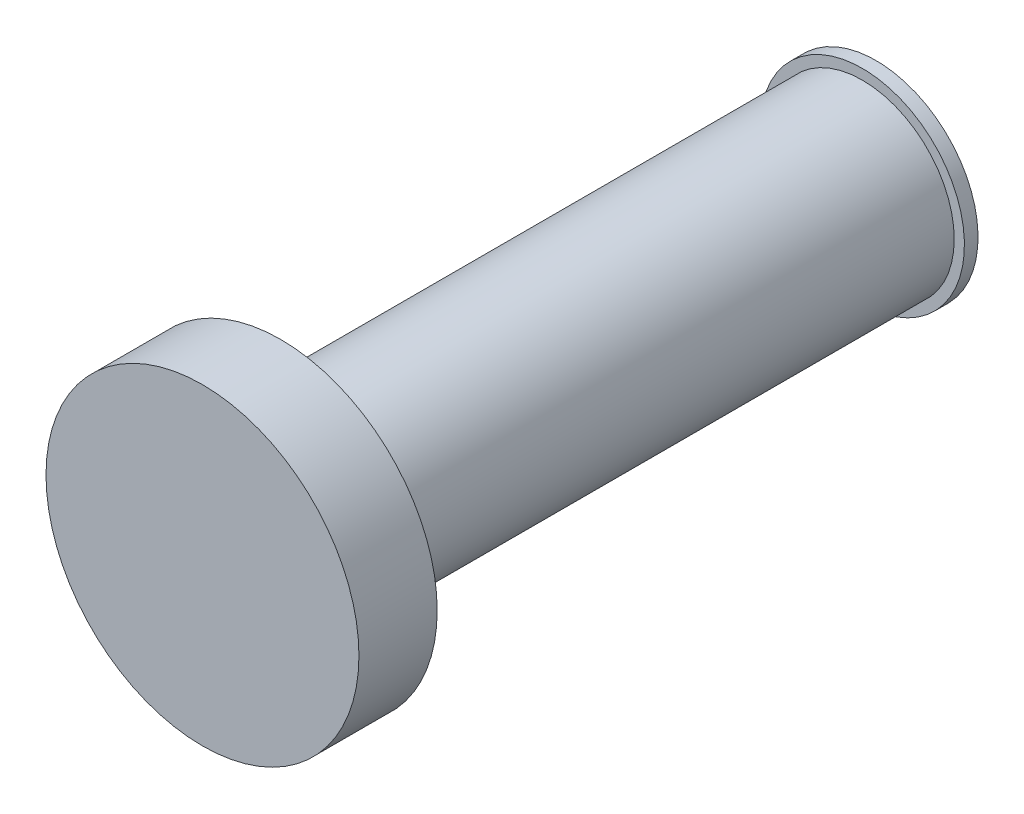
ISO-10303-21;
HEADER;
FILE_DESCRIPTION(('STEP AP214'),'2;1');
FILE_NAME('part.step','',(''),(''),'','','');
FILE_SCHEMA(('AUTOMOTIVE_DESIGN { 1 0 10303 214 1 1 1 1 }'));
ENDSEC;
DATA;
#1=APPLICATION_CONTEXT('core data for automotive mechanical design processes');
#2=APPLICATION_PROTOCOL_DEFINITION('international standard','automotive_design',2000,#1);
#3=PRODUCT_CONTEXT('',#1,'mechanical');
#4=PRODUCT('Part','Part','',(#3));
#5=PRODUCT_RELATED_PRODUCT_CATEGORY('part','',(#4));
#6=PRODUCT_DEFINITION_FORMATION('','',#4);
#7=PRODUCT_DEFINITION_CONTEXT('part definition',#1,'design');
#8=PRODUCT_DEFINITION('design','',#6,#7);
#9=PRODUCT_DEFINITION_SHAPE('','',#8);
#10=(LENGTH_UNIT() NAMED_UNIT(*) SI_UNIT(.MILLI.,.METRE.));
#11=(NAMED_UNIT(*) PLANE_ANGLE_UNIT() SI_UNIT($,.RADIAN.));
#12=(NAMED_UNIT(*) SI_UNIT($,.STERADIAN.) SOLID_ANGLE_UNIT());
#13=UNCERTAINTY_MEASURE_WITH_UNIT(LENGTH_MEASURE(1.E-05),#10,'distance_accuracy_value','');
#14=(GEOMETRIC_REPRESENTATION_CONTEXT(3) GLOBAL_UNCERTAINTY_ASSIGNED_CONTEXT((#13)) GLOBAL_UNIT_ASSIGNED_CONTEXT((#10,
#11,#12)) REPRESENTATION_CONTEXT('',''));
#15=CARTESIAN_POINT('',(0.,0.,0.));
#16=DIRECTION('',(0.,0.,1.));
#17=DIRECTION('',(1.,0.,0.));
#18=AXIS2_PLACEMENT_3D('',#15,#16,#17);
#19=CARTESIAN_POINT('',(0.,0.,-5.425));
#20=DIRECTION('',(0.,0.,1.));
#21=DIRECTION('',(1.,0.,0.));
#22=AXIS2_PLACEMENT_3D('',#19,#20,#21);
#23=CYLINDRICAL_SURFACE('',#22,1.5);
#24=CARTESIAN_POINT('',(0.,0.,-4.275));
#25=DIRECTION('',(0.,0.,-1.));
#26=DIRECTION('',(-1.,0.,0.));
#27=AXIS2_PLACEMENT_3D('',#24,#25,#26);
#28=CIRCLE('',#27,1.5);
#29=CARTESIAN_POINT('',(-1.5,0.,-4.275));
#30=VERTEX_POINT('',#29);
#31=EDGE_CURVE('E56',#30,#30,#28,.T.);
#32=ORIENTED_EDGE('',*,*,#31,.T.);
#33=EDGE_LOOP('',(#32));
#34=FACE_BOUND('',#33,.T.);
#35=CARTESIAN_POINT('',(0.,0.,-4.475));
#36=DIRECTION('',(0.,0.,1.));
#37=DIRECTION('',(0.,-1.,0.));
#38=AXIS2_PLACEMENT_3D('',#35,#36,#37);
#39=CIRCLE('',#38,1.5);
#40=CARTESIAN_POINT('',(0.,-1.5,-4.475));
#41=VERTEX_POINT('',#40);
#42=EDGE_CURVE('E59',#41,#41,#39,.T.);
#43=ORIENTED_EDGE('',*,*,#42,.T.);
#44=EDGE_LOOP('',(#43));
#45=FACE_BOUND('',#44,.T.);
#46=ADVANCED_FACE('F39',(#34,#45),#23,.T.);
#47=CARTESIAN_POINT('',(0.,0.,4.275));
#48=DIRECTION('',(0.,0.,-1.));
#49=DIRECTION('',(-1.,0.,0.));
#50=AXIS2_PLACEMENT_3D('',#47,#48,#49);
#51=CYLINDRICAL_SURFACE('',#50,1.35);
#52=CARTESIAN_POINT('',(0.,0.,4.275));
#53=DIRECTION('',(0.,0.,1.));
#54=DIRECTION('',(1.,0.,0.));
#55=AXIS2_PLACEMENT_3D('',#52,#53,#54);
#56=CIRCLE('',#55,1.35);
#57=CARTESIAN_POINT('',(1.35,0.,4.275));
#58=VERTEX_POINT('',#57);
#59=EDGE_CURVE('E10',#58,#58,#56,.T.);
#60=ORIENTED_EDGE('',*,*,#59,.F.);
#61=EDGE_LOOP('',(#60));
#62=FACE_BOUND('',#61,.T.);
#63=CARTESIAN_POINT('',(0.,0.,-4.275));
#64=DIRECTION('',(0.,0.,1.));
#65=DIRECTION('',(1.,0.,0.));
#66=AXIS2_PLACEMENT_3D('',#63,#64,#65);
#67=CIRCLE('',#66,1.35);
#68=CARTESIAN_POINT('',(1.35,0.,-4.275));
#69=VERTEX_POINT('',#68);
#70=EDGE_CURVE('E43',#69,#69,#67,.T.);
#71=ORIENTED_EDGE('',*,*,#70,.T.);
#72=EDGE_LOOP('',(#71));
#73=FACE_BOUND('',#72,.T.);
#74=ADVANCED_FACE('F41',(#62,#73),#51,.T.);
#75=CARTESIAN_POINT('',(0.,0.0240444249375334,5.425));
#76=DIRECTION('',(0.,0.,-1.));
#77=DIRECTION('',(-1.,0.,0.));
#78=AXIS2_PLACEMENT_3D('',#75,#76,#77);
#79=CYLINDRICAL_SURFACE('',#78,2.3);
#80=CARTESIAN_POINT('',(0.,0.0240444249375334,5.425));
#81=DIRECTION('',(0.,0.,1.));
#82=DIRECTION('',(1.,0.,0.));
#83=AXIS2_PLACEMENT_3D('',#80,#81,#82);
#84=CIRCLE('',#83,2.3);
#85=CARTESIAN_POINT('',(2.3,0.0240444249375334,5.425));
#86=VERTEX_POINT('',#85);
#87=EDGE_CURVE('E47',#86,#86,#84,.T.);
#88=ORIENTED_EDGE('',*,*,#87,.F.);
#89=EDGE_LOOP('',(#88));
#90=FACE_BOUND('',#89,.T.);
#91=CARTESIAN_POINT('',(0.,0.0240444249375334,4.275));
#92=DIRECTION('',(0.,0.,1.));
#93=DIRECTION('',(1.,0.,0.));
#94=AXIS2_PLACEMENT_3D('',#91,#92,#93);
#95=CIRCLE('',#94,2.3);
#96=CARTESIAN_POINT('',(2.3,0.0240444249375334,4.275));
#97=VERTEX_POINT('',#96);
#98=EDGE_CURVE('E51',#97,#97,#95,.T.);
#99=ORIENTED_EDGE('',*,*,#98,.T.);
#100=EDGE_LOOP('',(#99));
#101=FACE_BOUND('',#100,.T.);
#102=ADVANCED_FACE('F87',(#90,#101),#79,.T.);
#103=CARTESIAN_POINT('',(0.,0.0240444249375334,5.425));
#104=DIRECTION('',(0.,0.,1.));
#105=DIRECTION('',(1.,0.,0.));
#106=AXIS2_PLACEMENT_3D('',#103,#104,#105);
#107=PLANE('',#106);
#108=ORIENTED_EDGE('',*,*,#87,.T.);
#109=EDGE_LOOP('',(#108));
#110=FACE_BOUND('',#109,.T.);
#111=ADVANCED_FACE('F91',(#110),#107,.T.);
#112=CARTESIAN_POINT('',(0.,0.0240444249375334,4.275));
#113=DIRECTION('',(0.,0.,1.));
#114=DIRECTION('',(1.,0.,0.));
#115=AXIS2_PLACEMENT_3D('',#112,#113,#114);
#116=PLANE('',#115);
#117=ORIENTED_EDGE('',*,*,#59,.T.);
#118=EDGE_LOOP('',(#117));
#119=FACE_BOUND('',#118,.T.);
#120=ORIENTED_EDGE('',*,*,#98,.F.);
#121=EDGE_LOOP('',(#120));
#122=FACE_BOUND('',#121,.T.);
#123=ADVANCED_FACE('F79',(#119,#122),#116,.F.);
#124=CARTESIAN_POINT('',(0.,0.,-4.275));
#125=DIRECTION('',(0.,0.,-1.));
#126=DIRECTION('',(-1.,0.,0.));
#127=AXIS2_PLACEMENT_3D('',#124,#125,#126);
#128=PLANE('',#127);
#129=ORIENTED_EDGE('',*,*,#70,.F.);
#130=EDGE_LOOP('',(#129));
#131=FACE_BOUND('',#130,.T.);
#132=ORIENTED_EDGE('',*,*,#31,.F.);
#133=EDGE_LOOP('',(#132));
#134=FACE_BOUND('',#133,.T.);
#135=ADVANCED_FACE('F71',(#131,#134),#128,.F.);
#136=CARTESIAN_POINT('',(0.,0.,-5.225));
#137=DIRECTION('',(0.,0.,1.));
#138=DIRECTION('',(0.,-1.,0.));
#139=AXIS2_PLACEMENT_3D('',#136,#137,#138);
#140=PLANE('',#139);
#141=CARTESIAN_POINT('',(0.,0.,-5.225));
#142=DIRECTION('',(0.,0.,1.));
#143=DIRECTION('',(0.,-1.,0.));
#144=AXIS2_PLACEMENT_3D('',#141,#142,#143);
#145=CIRCLE('',#144,0.2);
#146=CARTESIAN_POINT('',(0.,-0.200000000000001,-5.225));
#147=VERTEX_POINT('',#146);
#148=EDGE_CURVE('E62',#147,#147,#145,.T.);
#149=ORIENTED_EDGE('',*,*,#148,.F.);
#150=EDGE_LOOP('',(#149));
#151=FACE_BOUND('',#150,.T.);
#152=ADVANCED_FACE('F69',(#151),#140,.F.);
#153=CARTESIAN_POINT('',(0.,0.,-4.475));
#154=DIRECTION('',(0.,0.,1.));
#155=DIRECTION('',(0.,-1.,0.));
#156=AXIS2_PLACEMENT_3D('',#153,#154,#155);
#157=CONICAL_SURFACE('',#156,1.5,1.04751800466292);
#158=CARTESIAN_POINT('',(0.,-0.200000000000001,-5.225));
#159=CARTESIAN_POINT('',(0.,-0.213541666666667,-5.2171875));
#160=CARTESIAN_POINT('',(0.,-0.227083333333334,-5.209375));
#161=CARTESIAN_POINT('',(0.,-0.254166666666668,-5.19375));
#162=CARTESIAN_POINT('',(0.,-0.267708333333335,-5.1859375));
#163=CARTESIAN_POINT('',(0.,-0.294791666666668,-5.1703125));
#164=CARTESIAN_POINT('',(0.,-0.308333333333335,-5.1625));
#165=CARTESIAN_POINT('',(0.,-0.335416666666668,-5.146875));
#166=CARTESIAN_POINT('',(0.,-0.348958333333334,-5.1390625));
#167=CARTESIAN_POINT('',(0.,-0.376041666666668,-5.1234375));
#168=CARTESIAN_POINT('',(0.,-0.389583333333334,-5.115625));
#169=CARTESIAN_POINT('',(0.,-0.416666666666668,-5.1));
#170=CARTESIAN_POINT('',(0.,-0.430208333333334,-5.0921875));
#171=CARTESIAN_POINT('',(0.,-0.457291666666668,-5.0765625));
#172=CARTESIAN_POINT('',(0.,-0.470833333333334,-5.06875));
#173=CARTESIAN_POINT('',(0.,-0.497916666666668,-5.053125));
#174=CARTESIAN_POINT('',(0.,-0.511458333333334,-5.0453125));
#175=CARTESIAN_POINT('',(0.,-0.538541666666668,-5.0296875));
#176=CARTESIAN_POINT('',(0.,-0.552083333333334,-5.021875));
#177=CARTESIAN_POINT('',(0.,-0.579166666666668,-5.00625));
#178=CARTESIAN_POINT('',(0.,-0.592708333333334,-4.9984375));
#179=CARTESIAN_POINT('',(0.,-0.619791666666668,-4.9828125));
#180=CARTESIAN_POINT('',(0.,-0.633333333333334,-4.975));
#181=CARTESIAN_POINT('',(0.,-0.660416666666668,-4.959375));
#182=CARTESIAN_POINT('',(0.,-0.673958333333334,-4.9515625));
#183=CARTESIAN_POINT('',(0.,-0.701041666666668,-4.9359375));
#184=CARTESIAN_POINT('',(0.,-0.714583333333334,-4.928125));
#185=CARTESIAN_POINT('',(0.,-0.741666666666667,-4.9125));
#186=CARTESIAN_POINT('',(0.,-0.755208333333334,-4.9046875));
#187=CARTESIAN_POINT('',(0.,-0.782291666666668,-4.8890625));
#188=CARTESIAN_POINT('',(0.,-0.795833333333334,-4.88125));
#189=CARTESIAN_POINT('',(0.,-0.822916666666668,-4.865625));
#190=CARTESIAN_POINT('',(0.,-0.836458333333334,-4.8578125));
#191=CARTESIAN_POINT('',(0.,-0.863541666666667,-4.8421875));
#192=CARTESIAN_POINT('',(0.,-0.877083333333334,-4.834375));
#193=CARTESIAN_POINT('',(0.,-0.904166666666667,-4.81875));
#194=CARTESIAN_POINT('',(0.,-0.917708333333334,-4.8109375));
#195=CARTESIAN_POINT('',(0.,-0.944791666666667,-4.7953125));
#196=CARTESIAN_POINT('',(0.,-0.958333333333334,-4.7875));
#197=CARTESIAN_POINT('',(0.,-0.985416666666667,-4.771875));
#198=CARTESIAN_POINT('',(0.,-0.998958333333334,-4.7640625));
#199=CARTESIAN_POINT('',(0.,-1.02604166666667,-4.7484375));
#200=CARTESIAN_POINT('',(0.,-1.03958333333333,-4.740625));
#201=CARTESIAN_POINT('',(0.,-1.06666666666667,-4.725));
#202=CARTESIAN_POINT('',(0.,-1.08020833333333,-4.7171875));
#203=CARTESIAN_POINT('',(0.,-1.10729166666667,-4.7015625));
#204=CARTESIAN_POINT('',(0.,-1.12083333333333,-4.69375));
#205=CARTESIAN_POINT('',(0.,-1.14791666666667,-4.678125));
#206=CARTESIAN_POINT('',(0.,-1.16145833333333,-4.6703125));
#207=CARTESIAN_POINT('',(0.,-1.18854166666667,-4.6546875));
#208=CARTESIAN_POINT('',(0.,-1.20208333333333,-4.646875));
#209=CARTESIAN_POINT('',(0.,-1.22916666666667,-4.63125));
#210=CARTESIAN_POINT('',(0.,-1.24270833333333,-4.6234375));
#211=CARTESIAN_POINT('',(0.,-1.26979166666667,-4.6078125));
#212=CARTESIAN_POINT('',(0.,-1.28333333333333,-4.6));
#213=CARTESIAN_POINT('',(0.,-1.31041666666667,-4.584375));
#214=CARTESIAN_POINT('',(0.,-1.32395833333333,-4.5765625));
#215=CARTESIAN_POINT('',(0.,-1.35104166666667,-4.5609375));
#216=CARTESIAN_POINT('',(0.,-1.36458333333333,-4.553125));
#217=CARTESIAN_POINT('',(0.,-1.39166666666667,-4.5375));
#218=CARTESIAN_POINT('',(0.,-1.40520833333333,-4.5296875));
#219=CARTESIAN_POINT('',(0.,-1.43229166666667,-4.5140625));
#220=CARTESIAN_POINT('',(0.,-1.44583333333333,-4.50625));
#221=CARTESIAN_POINT('',(0.,-1.47291666666667,-4.490625));
#222=CARTESIAN_POINT('',(0.,-1.48645833333333,-4.4828125));
#223=CARTESIAN_POINT('',(0.,-1.5,-4.475));
#224=B_SPLINE_CURVE_WITH_KNOTS('',3,(#158,#159,#160,#161,#162,#163,#164,#165,#166,#167,#168,
#169,#170,#171,#172,#173,#174,#175,#176,#177,#178,#179,#180,#181,#182,#183,#184,#185,#186,#187,
#188,#189,#190,#191,#192,#193,#194,#195,#196,#197,#198,#199,#200,#201,#202,#203,#204,#205,#206,
#207,#208,#209,#210,#211,#212,#213,#214,#215,#216,#217,#218,#219,#220,#221,#222,#223),
.UNSPECIFIED.,.F.,.F.,(4,2,2,2,2,2,2,2,2,2,2,2,2,2,2,2,2,2,2,2,2,2,2,2,2,2,2,2,2,2,2,2,4),(0.,
0.0469010344368867,0.0938020688737727,0.140703103310659,0.187604137747546,0.234505172184432,
0.281406206621319,0.328307241058205,0.375208275495091,0.422109309931977,0.469010344368864,
0.515911378805751,0.562812413242637,0.609713447679523,0.65661448211641,0.703515516553296,
0.750416550990182,0.797317585427068,0.844218619863955,0.891119654300841,0.938020688737728,
0.984921723174614,1.0318227576115,1.07872379204839,1.12562482648527,1.17252586092216,
1.21942689535905,1.26632792979593,1.31322896423282,1.3601299986697,1.40703103310659,
1.45393206754348,1.50083310198036),.UNSPECIFIED.);
#225=EDGE_CURVE('BSEAM66',#147,#41,#224,.T.);
#226=ORIENTED_EDGE('',*,*,#148,.T.);
#227=ORIENTED_EDGE('',*,*,#42,.F.);
#228=ORIENTED_EDGE('',*,*,#225,.T.);
#229=ORIENTED_EDGE('',*,*,#225,.F.);
#230=EDGE_LOOP('',(#226,#228,#227,#229));
#231=FACE_BOUND('',#230,.T.);
#232=ADVANCED_FACE('F66',(#231),#157,.T.);
#233=CLOSED_SHELL('',(#46,#74,#102,#111,#123,#135,#152,#232));
#234=MANIFOLD_SOLID_BREP('B2',#233);
#235=ADVANCED_BREP_SHAPE_REPRESENTATION('',(#18,#234),#14);
#236=SHAPE_DEFINITION_REPRESENTATION(#9,#235);
ENDSEC;
END-ISO-10303-21;
